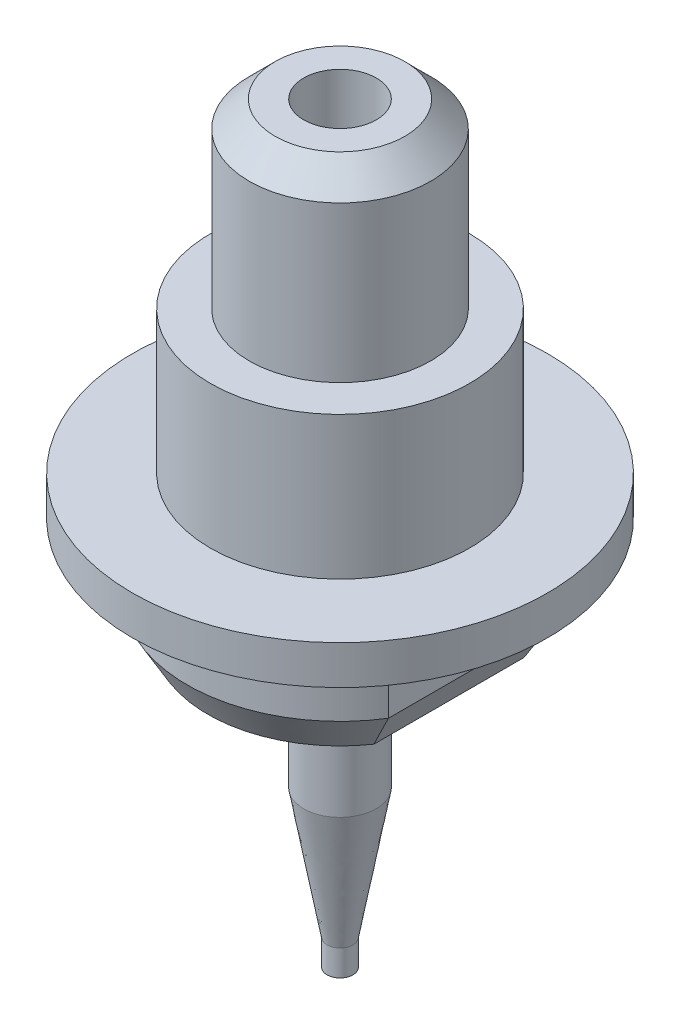
ISO-10303-21;
HEADER;
FILE_DESCRIPTION(('STEP AP214'),'2;1');
FILE_NAME('part.step','',(''),(''),'','','');
FILE_SCHEMA(('AUTOMOTIVE_DESIGN { 1 0 10303 214 1 1 1 1 }'));
ENDSEC;
DATA;
#1=APPLICATION_CONTEXT('core data for automotive mechanical design processes');
#2=APPLICATION_PROTOCOL_DEFINITION('international standard','automotive_design',2000,#1);
#3=PRODUCT_CONTEXT('',#1,'mechanical');
#4=PRODUCT('Part','Part','',(#3));
#5=PRODUCT_RELATED_PRODUCT_CATEGORY('part','',(#4));
#6=PRODUCT_DEFINITION_FORMATION('','',#4);
#7=PRODUCT_DEFINITION_CONTEXT('part definition',#1,'design');
#8=PRODUCT_DEFINITION('design','',#6,#7);
#9=PRODUCT_DEFINITION_SHAPE('','',#8);
#10=(LENGTH_UNIT() NAMED_UNIT(*) SI_UNIT(.MILLI.,.METRE.));
#11=(NAMED_UNIT(*) PLANE_ANGLE_UNIT() SI_UNIT($,.RADIAN.));
#12=(NAMED_UNIT(*) SI_UNIT($,.STERADIAN.) SOLID_ANGLE_UNIT());
#13=UNCERTAINTY_MEASURE_WITH_UNIT(LENGTH_MEASURE(1.E-05),#10,'distance_accuracy_value','');
#14=(GEOMETRIC_REPRESENTATION_CONTEXT(3) GLOBAL_UNCERTAINTY_ASSIGNED_CONTEXT((#13)) GLOBAL_UNIT_ASSIGNED_CONTEXT((#10,
#11,#12)) REPRESENTATION_CONTEXT('',''));
#15=CARTESIAN_POINT('',(0.,0.,0.));
#16=DIRECTION('',(0.,0.,1.));
#17=DIRECTION('',(1.,0.,0.));
#18=AXIS2_PLACEMENT_3D('',#15,#16,#17);
#19=CARTESIAN_POINT('',(0.,2.,0.));
#20=DIRECTION('',(0.,-1.,0.));
#21=DIRECTION('',(0.,0.,-1.));
#22=AXIS2_PLACEMENT_3D('',#19,#20,#21);
#23=PLANE('',#22);
#24=CARTESIAN_POINT('',(0.,2.,0.));
#25=DIRECTION('',(0.,-1.,0.));
#26=DIRECTION('',(0.,0.,-1.));
#27=AXIS2_PLACEMENT_3D('',#24,#25,#26);
#28=CIRCLE('',#27,1.4);
#29=CARTESIAN_POINT('',(0.,2.,-1.4));
#30=VERTEX_POINT('',#29);
#31=EDGE_CURVE('E93',#30,#30,#28,.T.);
#32=ORIENTED_EDGE('',*,*,#31,.F.);
#33=EDGE_LOOP('',(#32));
#34=FACE_BOUND('',#33,.T.);
#35=CARTESIAN_POINT('',(0.,2.,0.));
#36=DIRECTION('',(0.,-1.,0.));
#37=DIRECTION('',(0.,0.,-1.));
#38=AXIS2_PLACEMENT_3D('',#35,#36,#37);
#39=CIRCLE('',#38,0.75);
#40=CARTESIAN_POINT('',(0.,2.,-0.75));
#41=VERTEX_POINT('',#40);
#42=EDGE_CURVE('E97',#41,#41,#39,.T.);
#43=ORIENTED_EDGE('',*,*,#42,.T.);
#44=EDGE_LOOP('',(#43));
#45=FACE_BOUND('',#44,.T.);
#46=ADVANCED_FACE('F81',(#34,#45),#23,.F.);
#47=CARTESIAN_POINT('',(0.,-16.,0.));
#48=DIRECTION('',(0.,1.,0.));
#49=DIRECTION('',(0.,0.,1.));
#50=AXIS2_PLACEMENT_3D('',#47,#48,#49);
#51=CYLINDRICAL_SURFACE('',#50,1.4);
#52=CARTESIAN_POINT('',(0.,-16.,1.4));
#53=CARTESIAN_POINT('',(0.0393216937098484,-16.0000007892401,1.4000003131523));
#54=CARTESIAN_POINT('',(0.0786382960222943,-16.0001722090396,1.39834178095766));
#55=CARTESIAN_POINT('',(0.156995500797011,-16.0005925554339,1.39172572985046));
#56=CARTESIAN_POINT('',(0.196036025732516,-16.0008415029796,1.38676731877211));
#57=CARTESIAN_POINT('',(0.312393201915377,-16.001431235296,1.36696396784312));
#58=CARTESIAN_POINT('',(0.388933066664016,-16.001614783389,1.34719092020336));
#59=CARTESIAN_POINT('',(0.537529913877709,-16.0013074647237,1.29509338299826));
#60=CARTESIAN_POINT('',(0.609588813150662,-16.0008168884368,1.26277430365806));
#61=CARTESIAN_POINT('',(0.747253921050134,-15.9997458502921,1.18650677388441));
#62=CARTESIAN_POINT('',(0.812861629178133,-15.9991654094034,1.14256103473391));
#63=CARTESIAN_POINT('',(0.935791002007864,-15.9984849812148,1.04426634234537));
#64=CARTESIAN_POINT('',(0.993109976488983,-15.9983851495651,0.989914024754273));
#65=CARTESIAN_POINT('',(1.09781287014054,-15.9987596750445,0.872353853206715));
#66=CARTESIAN_POINT('',(1.14519629331879,-15.999234060831,0.80914555741402));
#67=CARTESIAN_POINT('',(1.22865735532298,-16.0003035901375,0.675717686181329));
#68=CARTESIAN_POINT('',(1.26474063268452,-16.0008986731871,0.605501630605559));
#69=CARTESIAN_POINT('',(1.3246183529307,-16.0015496609527,0.459965423719512));
#70=CARTESIAN_POINT('',(1.34841294539108,-16.0016055722314,0.384645334547272));
#71=CARTESIAN_POINT('',(1.37437057062438,-16.0012309362582,0.269556222117197));
#72=CARTESIAN_POINT('',(1.38140178719181,-16.0010294298944,0.230822258547849));
#73=CARTESIAN_POINT('',(1.39218160620722,-16.0005761710324,0.152890081471909));
#74=CARTESIAN_POINT('',(1.39593022353617,-16.000324418762,0.113691870070702));
#75=CARTESIAN_POINT('',(1.40011250319624,-16.000021919616,0.0351203280129748));
#76=CARTESIAN_POINT('',(1.4005461538853,-15.9999711734463,-0.00425300325807689));
#77=CARTESIAN_POINT('',(1.39809728077081,-16.0001583270204,-0.0828958674022004));
#78=CARTESIAN_POINT('',(1.39521472553051,-16.0003962295005,-0.122165399287745));
#79=CARTESIAN_POINT('',(1.3861518433967,-16.0008563887578,-0.200324924973521));
#80=CARTESIAN_POINT('',(1.37997149065616,-16.0010786454123,-0.239214915796604));
#81=CARTESIAN_POINT('',(1.36436323144387,-16.0014034085328,-0.316327101550431));
#82=CARTESIAN_POINT('',(1.3549353509499,-16.0015059159567,-0.354549301820425));
#83=CARTESIAN_POINT('',(1.32186464873798,-16.0015534186967,-0.467808402568983));
#84=CARTESIAN_POINT('',(1.29342654697467,-16.0012390385523,-0.541508124406898));
#85=CARTESIAN_POINT('',(1.22460634572269,-16.0002964313766,-0.683036831356676));
#86=CARTESIAN_POINT('',(1.18422601183096,-15.9996682507295,-0.750866682383589));
#87=CARTESIAN_POINT('',(1.09265342039527,-15.9987503471523,-0.878802011310766));
#88=CARTESIAN_POINT('',(1.04146130547654,-15.9984606197578,-0.938907591090083));
#89=CARTESIAN_POINT('',(0.929692437361932,-15.9984897331444,-1.04969818260673));
#90=CARTESIAN_POINT('',(0.869111748474547,-15.9988088297822,-1.10037922388515));
#91=CARTESIAN_POINT('',(0.740315773223336,-15.99975755049,-1.19085255236711));
#92=CARTESIAN_POINT('',(0.672100382080925,-16.0003871788223,-1.23064469010561));
#93=CARTESIAN_POINT('',(0.529911480865264,-16.001297649611,-1.29822214722529));
#94=CARTESIAN_POINT('',(0.455937850994468,-16.0015784848089,-1.32600721672603));
#95=CARTESIAN_POINT('',(0.34235284169462,-16.0014808249119,-1.35806865447328));
#96=CARTESIAN_POINT('',(0.304036126320944,-16.0013616176227,-1.36715500407447));
#97=CARTESIAN_POINT('',(0.22676387130786,-16.0010120957545,-1.38207240785148));
#98=CARTESIAN_POINT('',(0.187808327343779,-16.000781780423,-1.38790343998045));
#99=CARTESIAN_POINT('',(0.109562380828848,-16.0003263080238,-1.39626082628735));
#100=CARTESIAN_POINT('',(0.0702721177505815,-16.0001011489392,-1.3987884950574));
#101=CARTESIAN_POINT('',(-0.00838214677491609,-15.9999664582848,-1.40052742700166));
#102=CARTESIAN_POINT('',(-0.0477461476827115,-16.0000569244148,-1.39973871434319));
#103=CARTESIAN_POINT('',(-0.126269107623649,-16.0003998230533,-1.3948486775516));
#104=CARTESIAN_POINT('',(-0.165428067970524,-16.0006522545227,-1.39074737466906));
#105=CARTESIAN_POINT('',(-0.243252323295334,-16.0010945600716,-1.37926712670207));
#106=CARTESIAN_POINT('',(-0.28191761714092,-16.0012844340077,-1.37188817410088));
#107=CARTESIAN_POINT('',(-0.396769444466619,-16.0016157637235,-1.34489564728222));
#108=CARTESIAN_POINT('',(-0.471876795553557,-16.001519625736,-1.32042230532975));
#109=CARTESIAN_POINT('',(-0.616876241594359,-16.0008176078851,-1.25923209483822));
#110=CARTESIAN_POINT('',(-0.686768281901605,-16.0002117226813,-1.22251509803078));
#111=CARTESIAN_POINT('',(-0.819415933788415,-15.9991547900732,-1.13786815644837));
#112=CARTESIAN_POINT('',(-0.882171193700642,-15.9987037502968,-1.08993765947974));
#113=CARTESIAN_POINT('',(-0.998745844298316,-15.9983855367757,-0.984225086338901));
#114=CARTESIAN_POINT('',(-1.05256533041354,-15.9985183567952,-0.926443115389057));
#115=CARTESIAN_POINT('',(-1.14973824980986,-15.9992439924382,-0.802677742321164));
#116=CARTESIAN_POINT('',(-1.19309293613053,-15.9998367529531,-0.736695323547251));
#117=CARTESIAN_POINT('',(-1.26811656345905,-16.0008949154218,-0.598388119222348));
#118=CARTESIAN_POINT('',(-1.29978562215249,-16.0013603186583,-0.52606339755358));
#119=CARTESIAN_POINT('',(-1.35055332850714,-16.0016076192207,-0.377099628403767));
#120=CARTESIAN_POINT('',(-1.36964593791482,-16.0013891885107,-0.300458527666785));
#121=CARTESIAN_POINT('',(-1.39468943446018,-16.0005596139046,-0.145018687116253));
#122=CARTESIAN_POINT('',(-1.40064020351767,-15.99994846648,-0.0662199279224581));
#123=CARTESIAN_POINT('',(-1.39959672325148,-16.0000344026059,0.0518004322155933));
#124=CARTESIAN_POINT('',(-1.39758507188576,-16.0002303786809,0.0911233544943963));
#125=CARTESIAN_POINT('',(-1.3902628398081,-16.0006702445924,0.169460645909378));
#126=CARTESIAN_POINT('',(-1.38495221211298,-16.0009141351113,0.208475010643144));
#127=CARTESIAN_POINT('',(-1.36410900276799,-16.0014735246991,0.324624667771904));
#128=CARTESIAN_POINT('',(-1.3436643921085,-16.0016174914455,0.40093835770654));
#129=CARTESIAN_POINT('',(-1.29026577128235,-16.0012486033474,0.549015270429335));
#130=CARTESIAN_POINT('',(-1.25731088431899,-16.0007357024595,0.620778173859019));
#131=CARTESIAN_POINT('',(-1.17982334158538,-15.999656196509,0.757763361657951));
#132=CARTESIAN_POINT('',(-1.13529102049138,-15.9990895929991,0.822985835020064));
#133=CARTESIAN_POINT('',(-1.03590511134114,-15.9984563068909,0.94503773878526));
#134=CARTESIAN_POINT('',(-0.981050342228748,-15.9983896815339,1.00186620744817));
#135=CARTESIAN_POINT('',(-0.862564084261604,-15.9988190753378,1.10552218725675));
#136=CARTESIAN_POINT('',(-0.798930334819243,-15.9993152396554,1.15234711455006));
#137=CARTESIAN_POINT('',(-0.664714002845273,-16.0003934816277,1.23464791117073));
#138=CARTESIAN_POINT('',(-0.594131427457772,-16.0009755591939,1.27012379216593));
#139=CARTESIAN_POINT('',(-0.448064563813999,-16.0015751603895,1.32868892586905));
#140=CARTESIAN_POINT('',(-0.37258624750717,-16.0015933593409,1.35179296295379));
#141=CARTESIAN_POINT('',(-0.247206572320034,-16.0011352084038,1.37889993356999));
#142=CARTESIAN_POINT('',(-0.198110446695811,-16.0008383233323,1.38680295027653));
#143=CARTESIAN_POINT('',(-0.0993401723335178,-16.0002702207269,1.39735277978865));
#144=CARTESIAN_POINT('',(-0.0496660249013429,-15.999999003135,1.39999960446694));
#145=CARTESIAN_POINT('',(0.,-16.,1.4));
#146=B_SPLINE_CURVE_WITH_KNOTS('',3,(#52,#53,#54,#55,#56,#57,#58,#59,#60,#61,#62,#63,#64,#65,
#66,#67,#68,#69,#70,#71,#72,#73,#74,#75,#76,#77,#78,#79,#80,#81,#82,#83,#84,#85,#86,#87,#88,#89,
#90,#91,#92,#93,#94,#95,#96,#97,#98,#99,#100,#101,#102,#103,#104,#105,#106,#107,#108,#109,#110,
#111,#112,#113,#114,#115,#116,#117,#118,#119,#120,#121,#122,#123,#124,#125,#126,#127,#128,#129,
#130,#131,#132,#133,#134,#135,#136,#137,#138,#139,#140,#141,#142,#143,#144,#145),.UNSPECIFIED.,
.T.,.F.,(4,2,2,2,2,2,2,2,2,2,2,2,2,2,2,2,2,2,2,2,2,2,2,2,2,2,2,2,2,2,2,2,2,2,2,2,2,2,2,2,2,2,2,
2,2,2,4),(0.,0.117916829196745,0.235865551722404,0.471799692945596,0.707632205110841,
0.943409770631339,1.17926369001541,1.41512938065021,1.65087719103988,1.8866221318804,
2.00460988517337,2.1225971035908,2.24058473637584,2.3585734876614,2.47656316371679,
2.59455189596547,2.830319634321,3.06605253305254,3.30178232227264,3.53761119809127,
3.77344331082018,4.00928033124123,4.12730382337346,4.24532811481819,4.36330542351301,
4.48128187247834,4.5992575646194,4.717233527319,4.95299289827607,5.18875473919979,
5.42452819234123,5.66029912737336,5.89604181752405,6.13178213345232,6.3676355515945,
6.60349108888455,6.72149366395051,6.8394979196179,7.07529364650869,7.31110590245875,
7.54691134239164,7.78274377872893,8.01863705566359,8.25453009007826,8.49014059920752,
8.63907806479707,8.78801519396518),.UNSPECIFIED.);
#147=CARTESIAN_POINT('',(0.,-16.,-1.4));
#148=VERTEX_POINT('',#147);
#149=EDGE_CURVE('E13',#148,#148,#146,.F.);
#150=ORIENTED_EDGE('',*,*,#149,.F.);
#151=EDGE_LOOP('',(#150));
#152=FACE_BOUND('',#151,.T.);
#153=ORIENTED_EDGE('',*,*,#31,.T.);
#154=EDGE_LOOP('',(#153));
#155=FACE_BOUND('',#154,.T.);
#156=ADVANCED_FACE('F83',(#152,#155),#51,.T.);
#157=CARTESIAN_POINT('',(0.,-16.,0.));
#158=DIRECTION('',(0.,1.,0.));
#159=DIRECTION('',(0.,0.,1.));
#160=AXIS2_PLACEMENT_3D('',#157,#158,#159);
#161=CYLINDRICAL_SURFACE('',#160,0.75);
#162=CARTESIAN_POINT('',(0.,-16.,0.));
#163=DIRECTION('',(0.,-1.,0.));
#164=DIRECTION('',(0.,0.,-1.));
#165=AXIS2_PLACEMENT_3D('',#162,#163,#164);
#166=CIRCLE('',#165,0.75);
#167=CARTESIAN_POINT('',(0.,-16.,-0.75));
#168=VERTEX_POINT('',#167);
#169=EDGE_CURVE('E101',#168,#168,#166,.T.);
#170=ORIENTED_EDGE('',*,*,#169,.T.);
#171=EDGE_LOOP('',(#170));
#172=FACE_BOUND('',#171,.T.);
#173=ORIENTED_EDGE('',*,*,#42,.F.);
#174=EDGE_LOOP('',(#173));
#175=FACE_BOUND('',#174,.T.);
#176=ADVANCED_FACE('F132',(#172,#175),#161,.F.);
#177=CARTESIAN_POINT('',(0.,-16.,0.));
#178=DIRECTION('',(0.,-1.,0.));
#179=DIRECTION('',(0.,0.,-1.));
#180=AXIS2_PLACEMENT_3D('',#177,#178,#179);
#181=PLANE('',#180);
#182=ORIENTED_EDGE('',*,*,#169,.F.);
#183=EDGE_LOOP('',(#182));
#184=FACE_BOUND('',#183,.T.);
#185=ADVANCED_FACE('F130',(#184),#181,.F.);
#186=CARTESIAN_POINT('',(0.,-15.95,-1.409));
#187=CARTESIAN_POINT('',(0.,-15.9666666666667,-1.406));
#188=CARTESIAN_POINT('',(0.,-15.9833333333333,-1.403));
#189=CARTESIAN_POINT('',(0.,-16.,-1.4));
#190=CARTESIAN_POINT('',(0.,-17.6666666666667,-1.1));
#191=CARTESIAN_POINT('',(0.,-19.3333333333333,-0.8));
#192=CARTESIAN_POINT('',(0.,-21.,-0.5));
#193=CARTESIAN_POINT('',(0.0388824124490821,-15.95,-1.409));
#194=CARTESIAN_POINT('',(0.0387996251975936,-15.9666666666667,-1.406));
#195=CARTESIAN_POINT('',(0.0387168379461052,-15.9833333333333,-1.403));
#196=CARTESIAN_POINT('',(0.0386340506946167,-16.,-1.4));
#197=CARTESIAN_POINT('',(0.0303553255457703,-17.6666666666667,-1.1));
#198=CARTESIAN_POINT('',(0.0220766003969238,-19.3333333333333,-0.8));
#199=CARTESIAN_POINT('',(0.0137978752480773,-21.,-0.5));
#200=CARTESIAN_POINT('',(0.11591575485743,-15.95,-1.40584324124491));
#201=CARTESIAN_POINT('',(0.115668950553262,-15.9666666666667,-1.40284996251976));
#202=CARTESIAN_POINT('',(0.115422146249095,-15.9833333333333,-1.39985668379461));
#203=CARTESIAN_POINT('',(0.115175341944927,-16.,-1.39686340506946));
#204=CARTESIAN_POINT('',(0.090494911528157,-17.6666666666667,-1.09753553255458));
#205=CARTESIAN_POINT('',(0.0658144811113869,-19.3333333333333,-0.798207660039692));
#206=CARTESIAN_POINT('',(0.0411340506946168,-21.,-0.498879787524808));
#207=CARTESIAN_POINT('',(0.228907529560712,-15.95,-1.39200161828679));
#208=CARTESIAN_POINT('',(0.228420146602102,-15.9666666666667,-1.38903781072478));
#209=CARTESIAN_POINT('',(0.227932763643491,-15.9833333333333,-1.38607400316278));
#210=CARTESIAN_POINT('',(0.227445380684881,-16.,-1.38311019560078));
#211=CARTESIAN_POINT('',(0.178707084823835,-17.6666666666667,-1.08672943940061));
#212=CARTESIAN_POINT('',(0.129968788962789,-19.3333333333333,-0.790348683200447));
#213=CARTESIAN_POINT('',(0.0812304931017431,-21.,-0.493967927000279));
#214=CARTESIAN_POINT('',(0.338977273914962,-15.95,-1.36941730194297));
#215=CARTESIAN_POINT('',(0.338255533800168,-15.9666666666667,-1.3665015802213));
#216=CARTESIAN_POINT('',(0.337533793685374,-15.9833333333333,-1.36358585849964));
#217=CARTESIAN_POINT('',(0.33681205357058,-16.,-1.36067013677797));
#218=CARTESIAN_POINT('',(0.26463804209117,-17.6666666666667,-1.06909796461126));
#219=CARTESIAN_POINT('',(0.19246403061176,-19.3333333333333,-0.777525792444555));
#220=CARTESIAN_POINT('',(0.12029001913235,-21.,-0.485953620277847));
#221=CARTESIAN_POINT('',(0.979680809307521,-15.95,-1.18363799220468));
#222=CARTESIAN_POINT('',(0.977594902687278,-15.9666666666667,-1.18111782614604));
#223=CARTESIAN_POINT('',(0.975508996067035,-15.9833333333333,-1.17859766008741));
#224=CARTESIAN_POINT('',(0.973423089446791,-16.,-1.17607749402878));
#225=CARTESIAN_POINT('',(0.764832427422479,-17.6666666666667,-0.924060888165469));
#226=CARTESIAN_POINT('',(0.556241765398167,-19.3333333333333,-0.672044282302159));
#227=CARTESIAN_POINT('',(0.347651103373854,-21.,-0.420027676438849));
#228=CARTESIAN_POINT('',(1.409,-15.95,-0.622118599185318));
#229=CARTESIAN_POINT('',(1.406,-15.9666666666667,-0.620794003161503));
#230=CARTESIAN_POINT('',(1.403,-15.9833333333333,-0.619469407137687));
#231=CARTESIAN_POINT('',(1.4,-16.,-0.618144811113872));
#232=CARTESIAN_POINT('',(1.1,-17.6666666666667,-0.485685208732328));
#233=CARTESIAN_POINT('',(0.8,-19.3333333333333,-0.353225606350784));
#234=CARTESIAN_POINT('',(0.5,-21.,-0.22076600396924));
#235=CARTESIAN_POINT('',(1.409,-15.95,0.777648248981648));
#236=CARTESIAN_POINT('',(1.406,-15.9666666666667,0.775992503951878));
#237=CARTESIAN_POINT('',(1.403,-15.9833333333333,0.774336758922109));
#238=CARTESIAN_POINT('',(1.4,-16.,0.77268101389234));
#239=CARTESIAN_POINT('',(1.1,-17.6666666666667,0.60710651091541));
#240=CARTESIAN_POINT('',(0.8,-19.3333333333333,0.44153200793848));
#241=CARTESIAN_POINT('',(0.5,-21.,0.27595750496155));
#242=CARTESIAN_POINT('',(0.777648248981648,-15.95,1.409));
#243=CARTESIAN_POINT('',(0.775992503951879,-15.9666666666667,1.406));
#244=CARTESIAN_POINT('',(0.77433675892211,-15.9833333333333,1.403));
#245=CARTESIAN_POINT('',(0.77268101389234,-16.,1.4));
#246=CARTESIAN_POINT('',(0.60710651091541,-17.6666666666667,1.1));
#247=CARTESIAN_POINT('',(0.44153200793848,-19.3333333333333,0.8));
#248=CARTESIAN_POINT('',(0.27595750496155,-21.,0.5));
#249=CARTESIAN_POINT('',(-0.777648248981648,-15.95,1.409));
#250=CARTESIAN_POINT('',(-0.775992503951878,-15.9666666666667,1.406));
#251=CARTESIAN_POINT('',(-0.774336758922109,-15.9833333333333,1.403));
#252=CARTESIAN_POINT('',(-0.77268101389234,-16.,1.4));
#253=CARTESIAN_POINT('',(-0.60710651091541,-17.6666666666667,1.1));
#254=CARTESIAN_POINT('',(-0.44153200793848,-19.3333333333333,0.8));
#255=CARTESIAN_POINT('',(-0.27595750496155,-21.,0.5));
#256=CARTESIAN_POINT('',(-1.409,-15.95,0.777648248981648));
#257=CARTESIAN_POINT('',(-1.406,-15.9666666666667,0.775992503951879));
#258=CARTESIAN_POINT('',(-1.403,-15.9833333333333,0.77433675892211));
#259=CARTESIAN_POINT('',(-1.4,-16.,0.77268101389234));
#260=CARTESIAN_POINT('',(-1.1,-17.6666666666667,0.60710651091541));
#261=CARTESIAN_POINT('',(-0.8,-19.3333333333333,0.44153200793848));
#262=CARTESIAN_POINT('',(-0.5,-21.,0.27595750496155));
#263=CARTESIAN_POINT('',(-1.409,-15.95,-0.622118599185318));
#264=CARTESIAN_POINT('',(-1.406,-15.9666666666667,-0.620794003161503));
#265=CARTESIAN_POINT('',(-1.403,-15.9833333333333,-0.619469407137687));
#266=CARTESIAN_POINT('',(-1.4,-16.,-0.618144811113872));
#267=CARTESIAN_POINT('',(-1.1,-17.6666666666667,-0.485685208732328));
#268=CARTESIAN_POINT('',(-0.8,-19.3333333333333,-0.353225606350784));
#269=CARTESIAN_POINT('',(-0.5,-21.,-0.22076600396924));
#270=CARTESIAN_POINT('',(-0.979680809307521,-15.95,-1.18363799220468));
#271=CARTESIAN_POINT('',(-0.977594902687278,-15.9666666666667,-1.18111782614604));
#272=CARTESIAN_POINT('',(-0.975508996067035,-15.9833333333333,-1.17859766008741));
#273=CARTESIAN_POINT('',(-0.973423089446792,-16.,-1.17607749402878));
#274=CARTESIAN_POINT('',(-0.764832427422479,-17.6666666666667,-0.924060888165469));
#275=CARTESIAN_POINT('',(-0.556241765398167,-19.3333333333333,-0.672044282302159));
#276=CARTESIAN_POINT('',(-0.347651103373854,-21.,-0.420027676438849));
#277=CARTESIAN_POINT('',(-0.338977273914963,-15.95,-1.36941730194297));
#278=CARTESIAN_POINT('',(-0.338255533800168,-15.9666666666667,-1.3665015802213));
#279=CARTESIAN_POINT('',(-0.337533793685374,-15.9833333333333,-1.36358585849964));
#280=CARTESIAN_POINT('',(-0.33681205357058,-16.,-1.36067013677797));
#281=CARTESIAN_POINT('',(-0.26463804209117,-17.6666666666667,-1.06909796461126));
#282=CARTESIAN_POINT('',(-0.19246403061176,-19.3333333333333,-0.777525792444555));
#283=CARTESIAN_POINT('',(-0.12029001913235,-21.,-0.485953620277847));
#284=CARTESIAN_POINT('',(-0.228907529560713,-15.95,-1.39200161828679));
#285=CARTESIAN_POINT('',(-0.228420146602102,-15.9666666666667,-1.38903781072478));
#286=CARTESIAN_POINT('',(-0.227932763643492,-15.9833333333333,-1.38607400316278));
#287=CARTESIAN_POINT('',(-0.227445380684881,-16.,-1.38311019560078));
#288=CARTESIAN_POINT('',(-0.178707084823835,-17.6666666666667,-1.08672943940061));
#289=CARTESIAN_POINT('',(-0.129968788962789,-19.3333333333333,-0.790348683200446));
#290=CARTESIAN_POINT('',(-0.0812304931017433,-21.,-0.493967927000279));
#291=CARTESIAN_POINT('',(-0.115915754857431,-15.95,-1.40584324124491));
#292=CARTESIAN_POINT('',(-0.115668950553263,-15.9666666666667,-1.40284996251976));
#293=CARTESIAN_POINT('',(-0.115422146249095,-15.9833333333333,-1.39985668379461));
#294=CARTESIAN_POINT('',(-0.115175341944928,-16.,-1.39686340506946));
#295=CARTESIAN_POINT('',(-0.0904949115281575,-17.6666666666667,-1.09753553255458));
#296=CARTESIAN_POINT('',(-0.0658144811113873,-19.3333333333333,-0.798207660039692));
#297=CARTESIAN_POINT('',(-0.0411340506946171,-21.,-0.498879787524808));
#298=CARTESIAN_POINT('',(-0.0388824124490824,-15.95,-1.409));
#299=CARTESIAN_POINT('',(-0.038799625197594,-15.9666666666667,-1.406));
#300=CARTESIAN_POINT('',(-0.0387168379461055,-15.9833333333333,-1.403));
#301=CARTESIAN_POINT('',(-0.038634050694617,-16.,-1.4));
#302=CARTESIAN_POINT('',(-0.0303553255457705,-17.6666666666667,-1.1));
#303=CARTESIAN_POINT('',(-0.0220766003969241,-19.3333333333333,-0.8));
#304=CARTESIAN_POINT('',(-0.0137978752480776,-21.,-0.5));
#305=CARTESIAN_POINT('',(0.,-15.95,-1.409));
#306=CARTESIAN_POINT('',(0.,-15.9666666666667,-1.406));
#307=CARTESIAN_POINT('',(0.,-15.9833333333333,-1.403));
#308=CARTESIAN_POINT('',(0.,-16.,-1.4));
#309=CARTESIAN_POINT('',(0.,-17.6666666666667,-1.1));
#310=CARTESIAN_POINT('',(0.,-19.3333333333333,-0.8));
#311=CARTESIAN_POINT('',(0.,-21.,-0.5));
#312=B_SPLINE_SURFACE_WITH_KNOTS('',3,3,((#186,#187,#188,#189,#190,#191,#192),(#193,#194,#195,
#196,#197,#198,#199),(#200,#201,#202,#203,#204,#205,#206),(#207,#208,#209,#210,#211,#212,#213),
(#214,#215,#216,#217,#218,#219,#220),(#221,#222,#223,#224,#225,#226,#227),(#228,#229,#230,#231,
#232,#233,#234),(#235,#236,#237,#238,#239,#240,#241),(#242,#243,#244,#245,#246,#247,#248),(#249,
#250,#251,#252,#253,#254,#255),(#256,#257,#258,#259,#260,#261,#262),(#263,#264,#265,#266,#267,
#268,#269),(#270,#271,#272,#273,#274,#275,#276),(#277,#278,#279,#280,#281,#282,#283),(#284,#285,
#286,#287,#288,#289,#290),(#291,#292,#293,#294,#295,#296,#297),(#298,#299,#300,#301,#302,#303,
#304),(#305,#306,#307,#308,#309,#310,#311)),.UNSPECIFIED.,.T.,.F.,.F.,(4,1,1,1,1,2,2,2,1,1,1,1,
4),(4,3,4),(0.,0.0125,0.0249999999999999,0.0375000000000001,0.05,0.25,0.5,0.75,0.95,0.9625,
0.975,0.9875,1.),(-0.01,0.,1.),.UNSPECIFIED.);
#313=CARTESIAN_POINT('',(0.,-21.,0.));
#314=DIRECTION('',(0.,-1.,0.));
#315=DIRECTION('',(0.,0.,-1.));
#316=AXIS2_PLACEMENT_3D('',#313,#314,#315);
#317=CIRCLE('',#316,0.5);
#318=CARTESIAN_POINT('',(0.,-21.,-0.5));
#319=VERTEX_POINT('',#318);
#320=EDGE_CURVE('E106',#319,#319,#317,.T.);
#321=CARTESIAN_POINT('',(0.,-16.,-1.4));
#322=CARTESIAN_POINT('',(0.,-16.0520833333333,-1.390625));
#323=CARTESIAN_POINT('',(0.,-16.1041666666667,-1.38125));
#324=CARTESIAN_POINT('',(0.,-16.2083333333333,-1.3625));
#325=CARTESIAN_POINT('',(0.,-16.2604166666667,-1.353125));
#326=CARTESIAN_POINT('',(0.,-16.3645833333333,-1.334375));
#327=CARTESIAN_POINT('',(0.,-16.4166666666667,-1.325));
#328=CARTESIAN_POINT('',(0.,-16.5208333333333,-1.30625));
#329=CARTESIAN_POINT('',(0.,-16.5729166666667,-1.296875));
#330=CARTESIAN_POINT('',(0.,-16.6770833333333,-1.278125));
#331=CARTESIAN_POINT('',(0.,-16.7291666666667,-1.26875));
#332=CARTESIAN_POINT('',(0.,-16.8333333333333,-1.25));
#333=CARTESIAN_POINT('',(0.,-16.8854166666667,-1.240625));
#334=CARTESIAN_POINT('',(0.,-16.9895833333333,-1.221875));
#335=CARTESIAN_POINT('',(0.,-17.0416666666667,-1.2125));
#336=CARTESIAN_POINT('',(0.,-17.1458333333333,-1.19375));
#337=CARTESIAN_POINT('',(0.,-17.1979166666667,-1.184375));
#338=CARTESIAN_POINT('',(0.,-17.3020833333333,-1.165625));
#339=CARTESIAN_POINT('',(0.,-17.3541666666667,-1.15625));
#340=CARTESIAN_POINT('',(0.,-17.4583333333333,-1.1375));
#341=CARTESIAN_POINT('',(0.,-17.5104166666667,-1.128125));
#342=CARTESIAN_POINT('',(0.,-17.6145833333333,-1.109375));
#343=CARTESIAN_POINT('',(0.,-17.6666666666667,-1.1));
#344=CARTESIAN_POINT('',(0.,-17.7708333333333,-1.08125));
#345=CARTESIAN_POINT('',(0.,-17.8229166666667,-1.071875));
#346=CARTESIAN_POINT('',(0.,-17.9270833333333,-1.053125));
#347=CARTESIAN_POINT('',(0.,-17.9791666666667,-1.04375));
#348=CARTESIAN_POINT('',(0.,-18.0833333333333,-1.025));
#349=CARTESIAN_POINT('',(0.,-18.1354166666667,-1.015625));
#350=CARTESIAN_POINT('',(0.,-18.2395833333333,-0.996875));
#351=CARTESIAN_POINT('',(0.,-18.2916666666667,-0.9875));
#352=CARTESIAN_POINT('',(0.,-18.3958333333333,-0.96875));
#353=CARTESIAN_POINT('',(0.,-18.4479166666667,-0.959375));
#354=CARTESIAN_POINT('',(0.,-18.5520833333333,-0.940625));
#355=CARTESIAN_POINT('',(0.,-18.6041666666667,-0.93125));
#356=CARTESIAN_POINT('',(0.,-18.7083333333333,-0.9125));
#357=CARTESIAN_POINT('',(0.,-18.7604166666667,-0.903125));
#358=CARTESIAN_POINT('',(0.,-18.8645833333333,-0.884375));
#359=CARTESIAN_POINT('',(0.,-18.9166666666667,-0.875));
#360=CARTESIAN_POINT('',(0.,-19.0208333333333,-0.85625));
#361=CARTESIAN_POINT('',(0.,-19.0729166666667,-0.846875));
#362=CARTESIAN_POINT('',(0.,-19.1770833333333,-0.828125));
#363=CARTESIAN_POINT('',(0.,-19.2291666666667,-0.81875));
#364=CARTESIAN_POINT('',(0.,-19.3333333333333,-0.8));
#365=CARTESIAN_POINT('',(0.,-19.3854166666667,-0.790625));
#366=CARTESIAN_POINT('',(0.,-19.4895833333333,-0.771875));
#367=CARTESIAN_POINT('',(0.,-19.5416666666667,-0.7625));
#368=CARTESIAN_POINT('',(0.,-19.6458333333333,-0.74375));
#369=CARTESIAN_POINT('',(0.,-19.6979166666667,-0.734375));
#370=CARTESIAN_POINT('',(0.,-19.8020833333333,-0.715625));
#371=CARTESIAN_POINT('',(0.,-19.8541666666667,-0.70625));
#372=CARTESIAN_POINT('',(0.,-19.9583333333333,-0.6875));
#373=CARTESIAN_POINT('',(0.,-20.0104166666667,-0.678125));
#374=CARTESIAN_POINT('',(0.,-20.1145833333333,-0.659375));
#375=CARTESIAN_POINT('',(0.,-20.1666666666667,-0.65));
#376=CARTESIAN_POINT('',(0.,-20.2708333333333,-0.63125));
#377=CARTESIAN_POINT('',(0.,-20.3229166666667,-0.621875));
#378=CARTESIAN_POINT('',(0.,-20.4270833333333,-0.603125));
#379=CARTESIAN_POINT('',(0.,-20.4791666666667,-0.59375));
#380=CARTESIAN_POINT('',(0.,-20.5833333333333,-0.575));
#381=CARTESIAN_POINT('',(0.,-20.6354166666667,-0.565625));
#382=CARTESIAN_POINT('',(0.,-20.7395833333333,-0.546875));
#383=CARTESIAN_POINT('',(0.,-20.7916666666667,-0.5375));
#384=CARTESIAN_POINT('',(0.,-20.8958333333333,-0.51875));
#385=CARTESIAN_POINT('',(0.,-20.9479166666667,-0.509375));
#386=CARTESIAN_POINT('',(0.,-21.,-0.5));
#387=B_SPLINE_CURVE_WITH_KNOTS('',3,(#321,#322,#323,#324,#325,#326,#327,#328,#329,#330,#331,
#332,#333,#334,#335,#336,#337,#338,#339,#340,#341,#342,#343,#344,#345,#346,#347,#348,#349,#350,
#351,#352,#353,#354,#355,#356,#357,#358,#359,#360,#361,#362,#363,#364,#365,#366,#367,#368,#369,
#370,#371,#372,#373,#374,#375,#376,#377,#378,#379,#380,#381,#382,#383,#384,#385,#386),
.UNSPECIFIED.,.F.,.F.,(4,2,2,2,2,2,2,2,2,2,2,2,2,2,2,2,2,2,2,2,2,2,2,2,2,2,2,2,2,2,2,2,4),(0.,
0.158761072448507,0.317522144897014,0.476283217345521,0.635044289794031,0.793805362242531,
0.952566434691038,1.11132750713954,1.27008857958805,1.42884965203656,1.58761072448507,
1.74637179693357,1.90513286938208,2.06389394183059,2.2226550142791,2.3814160867276,
2.54017715917611,2.69893823162462,2.85769930407312,3.01646037652163,3.17522144897014,
3.33398252141864,3.49274359386715,3.65150466631566,3.81026573876416,3.96902681121267,
4.12778788366118,4.28654895610968,4.44531002855819,4.6040711010067,4.7628321734552,
4.92159324590371,5.08035431835222),.UNSPECIFIED.);
#388=EDGE_CURVE('BSEAM117',#148,#319,#387,.T.);
#389=ORIENTED_EDGE('',*,*,#149,.T.);
#390=ORIENTED_EDGE('',*,*,#320,.F.);
#391=ORIENTED_EDGE('',*,*,#388,.T.);
#392=ORIENTED_EDGE('',*,*,#388,.F.);
#393=EDGE_LOOP('',(#389,#391,#390,#392));
#394=FACE_BOUND('',#393,.T.);
#395=ADVANCED_FACE('F117',(#394),#312,.T.);
#396=CARTESIAN_POINT('',(0.,-22.,0.));
#397=DIRECTION('',(0.,1.,0.));
#398=DIRECTION('',(0.,0.,1.));
#399=AXIS2_PLACEMENT_3D('',#396,#397,#398);
#400=CYLINDRICAL_SURFACE('',#399,0.5);
#401=CARTESIAN_POINT('',(0.,-22.,0.));
#402=DIRECTION('',(0.,-1.,0.));
#403=DIRECTION('',(0.,0.,-1.));
#404=AXIS2_PLACEMENT_3D('',#401,#402,#403);
#405=CIRCLE('',#404,0.5);
#406=CARTESIAN_POINT('',(0.,-22.,-0.5));
#407=VERTEX_POINT('',#406);
#408=EDGE_CURVE('E111',#407,#407,#405,.T.);
#409=ORIENTED_EDGE('',*,*,#408,.F.);
#410=EDGE_LOOP('',(#409));
#411=FACE_BOUND('',#410,.T.);
#412=ORIENTED_EDGE('',*,*,#320,.T.);
#413=EDGE_LOOP('',(#412));
#414=FACE_BOUND('',#413,.T.);
#415=ADVANCED_FACE('F129',(#411,#414),#400,.T.);
#416=CARTESIAN_POINT('',(0.,-22.,0.));
#417=DIRECTION('',(0.,-1.,0.));
#418=DIRECTION('',(0.,0.,-1.));
#419=AXIS2_PLACEMENT_3D('',#416,#417,#418);
#420=PLANE('',#419);
#421=ORIENTED_EDGE('',*,*,#408,.T.);
#422=EDGE_LOOP('',(#421));
#423=FACE_BOUND('',#422,.T.);
#424=ADVANCED_FACE('F172',(#423),#420,.T.);
#425=CLOSED_SHELL('',(#46,#156,#176,#185,#395,#415,#424));
#426=MANIFOLD_SOLID_BREP('B2',#425);
#427=CARTESIAN_POINT('',(0.,-11.,0.));
#428=DIRECTION('',(0.,1.,0.));
#429=DIRECTION('',(0.,0.,1.));
#430=AXIS2_PLACEMENT_3D('',#427,#428,#429);
#431=CYLINDRICAL_SURFACE('',#430,5.9);
#432=DIRECTION('',(0.,-1.,0.));
#433=VECTOR('',#432,1.);
#434=CARTESIAN_POINT('',(5.,-7.,-3.13209195267317));
#435=LINE('',#434,#433);
#436=CARTESIAN_POINT('',(5.,-7.,-3.13209195267317));
#437=VERTEX_POINT('',#436);
#438=CARTESIAN_POINT('',(5.,-9.6143593539449,-3.13209195267317));
#439=VERTEX_POINT('',#438);
#440=EDGE_CURVE('E443',#437,#439,#435,.T.);
#441=ORIENTED_EDGE('',*,*,#440,.T.);
#442=CARTESIAN_POINT('',(0.,-9.6143593539449,0.));
#443=DIRECTION('',(0.,-1.,0.));
#444=DIRECTION('',(0.,0.,-1.));
#445=AXIS2_PLACEMENT_3D('',#442,#443,#444);
#446=CIRCLE('',#445,5.9);
#447=CARTESIAN_POINT('',(-5.,-9.6143593539449,-3.13209195267317));
#448=VERTEX_POINT('',#447);
#449=EDGE_CURVE('E259',#439,#448,#446,.F.);
#450=ORIENTED_EDGE('',*,*,#449,.T.);
#451=DIRECTION('',(0.,-1.,0.));
#452=VECTOR('',#451,1.);
#453=CARTESIAN_POINT('',(-5.,-7.,-3.13209195267317));
#454=LINE('',#453,#452);
#455=CARTESIAN_POINT('',(-5.,-7.,-3.13209195267317));
#456=VERTEX_POINT('',#455);
#457=EDGE_CURVE('E306',#456,#448,#454,.T.);
#458=ORIENTED_EDGE('',*,*,#457,.F.);
#459=CARTESIAN_POINT('',(0.,-7.,0.));
#460=DIRECTION('',(0.,-1.,0.));
#461=DIRECTION('',(0.,0.,-1.));
#462=AXIS2_PLACEMENT_3D('',#459,#460,#461);
#463=CIRCLE('',#462,5.9);
#464=EDGE_CURVE('E317',#456,#437,#463,.T.);
#465=ORIENTED_EDGE('',*,*,#464,.T.);
#466=EDGE_LOOP('',(#441,#450,#458,#465));
#467=FACE_BOUND('',#466,.T.);
#468=ADVANCED_FACE('F244',(#467),#431,.T.);
#469=CARTESIAN_POINT('',(0.,7.,0.));
#470=DIRECTION('',(0.,-1.,0.));
#471=DIRECTION('',(0.,0.,-1.));
#472=AXIS2_PLACEMENT_3D('',#469,#470,#471);
#473=CYLINDRICAL_SURFACE('',#472,3.5);
#474=CARTESIAN_POINT('',(0.,6.,0.));
#475=DIRECTION('',(0.,1.,0.));
#476=DIRECTION('',(0.,0.,1.));
#477=AXIS2_PLACEMENT_3D('',#474,#475,#476);
#478=CIRCLE('',#477,3.5);
#479=CARTESIAN_POINT('',(0.,6.,3.5));
#480=VERTEX_POINT('',#479);
#481=EDGE_CURVE('E323',#480,#480,#478,.F.);
#482=ORIENTED_EDGE('',*,*,#481,.T.);
#483=EDGE_LOOP('',(#482));
#484=FACE_BOUND('',#483,.T.);
#485=CARTESIAN_POINT('',(0.,0.,0.));
#486=DIRECTION('',(0.,1.,0.));
#487=DIRECTION('',(0.,0.,1.));
#488=AXIS2_PLACEMENT_3D('',#485,#486,#487);
#489=CIRCLE('',#488,3.5);
#490=CARTESIAN_POINT('',(0.,0.,3.5));
#491=VERTEX_POINT('',#490);
#492=EDGE_CURVE('E342',#491,#491,#489,.T.);
#493=ORIENTED_EDGE('',*,*,#492,.T.);
#494=EDGE_LOOP('',(#493));
#495=FACE_BOUND('',#494,.T.);
#496=ADVANCED_FACE('F405',(#484,#495),#473,.T.);
#497=CARTESIAN_POINT('',(0.,7.,0.));
#498=DIRECTION('',(0.,1.,0.));
#499=DIRECTION('',(0.,0.,1.));
#500=AXIS2_PLACEMENT_3D('',#497,#498,#499);
#501=PLANE('',#500);
#502=CARTESIAN_POINT('',(0.,7.,0.));
#503=DIRECTION('',(0.,1.,0.));
#504=DIRECTION('',(0.,0.,1.));
#505=AXIS2_PLACEMENT_3D('',#502,#503,#504);
#506=CIRCLE('',#505,1.4);
#507=CARTESIAN_POINT('',(0.,7.,1.4));
#508=VERTEX_POINT('',#507);
#509=EDGE_CURVE('E451',#508,#508,#506,.T.);
#510=ORIENTED_EDGE('',*,*,#509,.F.);
#511=EDGE_LOOP('',(#510));
#512=FACE_BOUND('',#511,.T.);
#513=CARTESIAN_POINT('',(0.,7.,0.));
#514=DIRECTION('',(0.,1.,0.));
#515=DIRECTION('',(0.,0.,1.));
#516=AXIS2_PLACEMENT_3D('',#513,#514,#515);
#517=CIRCLE('',#516,2.5);
#518=CARTESIAN_POINT('',(0.,7.,2.5));
#519=VERTEX_POINT('',#518);
#520=EDGE_CURVE('E327',#519,#519,#517,.T.);
#521=ORIENTED_EDGE('',*,*,#520,.T.);
#522=EDGE_LOOP('',(#521));
#523=FACE_BOUND('',#522,.T.);
#524=ADVANCED_FACE('F412',(#512,#523),#501,.T.);
#525=CARTESIAN_POINT('',(0.,7.,0.));
#526=DIRECTION('',(0.,-1.,0.));
#527=DIRECTION('',(0.,0.,-1.));
#528=AXIS2_PLACEMENT_3D('',#525,#526,#527);
#529=CONICAL_SURFACE('',#528,2.5,0.785398163397447);
#530=ORIENTED_EDGE('',*,*,#481,.F.);
#531=EDGE_LOOP('',(#530));
#532=FACE_BOUND('',#531,.T.);
#533=ORIENTED_EDGE('',*,*,#520,.F.);
#534=EDGE_LOOP('',(#533));
#535=FACE_BOUND('',#534,.T.);
#536=ADVANCED_FACE('F464',(#532,#535),#529,.T.);
#537=CARTESIAN_POINT('',(0.,-5.5,0.));
#538=DIRECTION('',(0.,1.,0.));
#539=DIRECTION('',(0.,0.,1.));
#540=AXIS2_PLACEMENT_3D('',#537,#538,#539);
#541=CYLINDRICAL_SURFACE('',#540,5.);
#542=CARTESIAN_POINT('',(0.,-5.5,0.));
#543=DIRECTION('',(0.,-1.,0.));
#544=DIRECTION('',(0.,0.,-1.));
#545=AXIS2_PLACEMENT_3D('',#542,#543,#544);
#546=CIRCLE('',#545,5.);
#547=CARTESIAN_POINT('',(0.,-5.5,-5.));
#548=VERTEX_POINT('',#547);
#549=EDGE_CURVE('E339',#548,#548,#546,.T.);
#550=ORIENTED_EDGE('',*,*,#549,.F.);
#551=EDGE_LOOP('',(#550));
#552=FACE_BOUND('',#551,.T.);
#553=CARTESIAN_POINT('',(0.,0.,0.));
#554=DIRECTION('',(0.,-1.,0.));
#555=DIRECTION('',(0.,0.,-1.));
#556=AXIS2_PLACEMENT_3D('',#553,#554,#555);
#557=CIRCLE('',#556,5.);
#558=CARTESIAN_POINT('',(0.,0.,-5.));
#559=VERTEX_POINT('',#558);
#560=EDGE_CURVE('E335',#559,#559,#557,.T.);
#561=ORIENTED_EDGE('',*,*,#560,.T.);
#562=EDGE_LOOP('',(#561));
#563=FACE_BOUND('',#562,.T.);
#564=ADVANCED_FACE('F469',(#552,#563),#541,.T.);
#565=CARTESIAN_POINT('',(0.,0.,0.));
#566=DIRECTION('',(0.,-1.,0.));
#567=DIRECTION('',(0.,0.,-1.));
#568=AXIS2_PLACEMENT_3D('',#565,#566,#567);
#569=PLANE('',#568);
#570=ORIENTED_EDGE('',*,*,#492,.F.);
#571=EDGE_LOOP('',(#570));
#572=FACE_BOUND('',#571,.T.);
#573=ORIENTED_EDGE('',*,*,#560,.F.);
#574=EDGE_LOOP('',(#573));
#575=FACE_BOUND('',#574,.T.);
#576=ADVANCED_FACE('F474',(#572,#575),#569,.F.);
#577=CARTESIAN_POINT('',(0.,-7.,0.));
#578=DIRECTION('',(0.,1.,0.));
#579=DIRECTION('',(0.,0.,1.));
#580=AXIS2_PLACEMENT_3D('',#577,#578,#579);
#581=CYLINDRICAL_SURFACE('',#580,8.);
#582=CARTESIAN_POINT('',(0.,-7.,0.));
#583=DIRECTION('',(0.,-1.,0.));
#584=DIRECTION('',(0.,0.,-1.));
#585=AXIS2_PLACEMENT_3D('',#582,#583,#584);
#586=CIRCLE('',#585,8.);
#587=CARTESIAN_POINT('',(0.,-7.,-8.));
#588=VERTEX_POINT('',#587);
#589=EDGE_CURVE('E332',#588,#588,#586,.T.);
#590=ORIENTED_EDGE('',*,*,#589,.F.);
#591=EDGE_LOOP('',(#590));
#592=FACE_BOUND('',#591,.T.);
#593=CARTESIAN_POINT('',(0.,-5.5,0.));
#594=DIRECTION('',(0.,-1.,0.));
#595=DIRECTION('',(0.,0.,-1.));
#596=AXIS2_PLACEMENT_3D('',#593,#594,#595);
#597=CIRCLE('',#596,8.);
#598=CARTESIAN_POINT('',(0.,-5.5,-8.));
#599=VERTEX_POINT('',#598);
#600=EDGE_CURVE('E336',#599,#599,#597,.T.);
#601=ORIENTED_EDGE('',*,*,#600,.T.);
#602=EDGE_LOOP('',(#601));
#603=FACE_BOUND('',#602,.T.);
#604=ADVANCED_FACE('F484',(#592,#603),#581,.T.);
#605=CARTESIAN_POINT('',(0.,-7.,0.));
#606=DIRECTION('',(0.,-1.,0.));
#607=DIRECTION('',(0.,0.,-1.));
#608=AXIS2_PLACEMENT_3D('',#605,#606,#607);
#609=PLANE('',#608);
#610=CARTESIAN_POINT('',(5.,-7.,3.13209195267317));
#611=VERTEX_POINT('',#610);
#612=CARTESIAN_POINT('',(-5.,-7.,3.13209195267317));
#613=VERTEX_POINT('',#612);
#614=EDGE_CURVE('E322',#611,#613,#463,.T.);
#615=ORIENTED_EDGE('',*,*,#614,.F.);
#616=DIRECTION('',(0.,0.,-1.));
#617=VECTOR('',#616,1.);
#618=CARTESIAN_POINT('',(5.,-7.,3.13209195267317));
#619=LINE('',#618,#617);
#620=EDGE_CURVE('E314',#611,#437,#619,.T.);
#621=ORIENTED_EDGE('',*,*,#620,.T.);
#622=ORIENTED_EDGE('',*,*,#464,.F.);
#623=DIRECTION('',(0.,0.,1.));
#624=VECTOR('',#623,1.);
#625=CARTESIAN_POINT('',(-5.,-7.,3.13209195267317));
#626=LINE('',#625,#624);
#627=EDGE_CURVE('E304',#456,#613,#626,.T.);
#628=ORIENTED_EDGE('',*,*,#627,.T.);
#629=EDGE_LOOP('',(#615,#621,#622,#628));
#630=FACE_BOUND('',#629,.T.);
#631=ORIENTED_EDGE('',*,*,#589,.T.);
#632=EDGE_LOOP('',(#631));
#633=FACE_BOUND('',#632,.T.);
#634=ADVANCED_FACE('F320',(#630,#633),#609,.T.);
#635=CARTESIAN_POINT('',(0.,-5.5,0.));
#636=DIRECTION('',(0.,-1.,0.));
#637=DIRECTION('',(0.,0.,-1.));
#638=AXIS2_PLACEMENT_3D('',#635,#636,#637);
#639=PLANE('',#638);
#640=ORIENTED_EDGE('',*,*,#549,.T.);
#641=EDGE_LOOP('',(#640));
#642=FACE_BOUND('',#641,.T.);
#643=ORIENTED_EDGE('',*,*,#600,.F.);
#644=EDGE_LOOP('',(#643));
#645=FACE_BOUND('',#644,.T.);
#646=ADVANCED_FACE('F419',(#642,#645),#639,.F.);
#647=DIRECTION('',(0.,-1.,0.));
#648=VECTOR('',#647,1.);
#649=CARTESIAN_POINT('',(-5.,-7.,3.13209195267317));
#650=LINE('',#649,#648);
#651=CARTESIAN_POINT('',(-5.,-9.6143593539449,3.13209195267317));
#652=VERTEX_POINT('',#651);
#653=EDGE_CURVE('E309',#613,#652,#650,.T.);
#654=ORIENTED_EDGE('',*,*,#653,.T.);
#655=CARTESIAN_POINT('',(0.,-9.6143593539449,0.));
#656=DIRECTION('',(0.,-1.,0.));
#657=DIRECTION('',(0.,0.,-1.));
#658=AXIS2_PLACEMENT_3D('',#655,#656,#657);
#659=CIRCLE('',#658,5.9);
#660=CARTESIAN_POINT('',(5.,-9.6143593539449,3.13209195267317));
#661=VERTEX_POINT('',#660);
#662=EDGE_CURVE('E357',#652,#661,#659,.F.);
#663=ORIENTED_EDGE('',*,*,#662,.T.);
#664=DIRECTION('',(0.,-1.,0.));
#665=VECTOR('',#664,1.);
#666=CARTESIAN_POINT('',(5.,-7.,3.13209195267317));
#667=LINE('',#666,#665);
#668=EDGE_CURVE('E448',#611,#661,#667,.T.);
#669=ORIENTED_EDGE('',*,*,#668,.F.);
#670=ORIENTED_EDGE('',*,*,#614,.T.);
#671=EDGE_LOOP('',(#654,#663,#669,#670));
#672=FACE_BOUND('',#671,.T.);
#673=ADVANCED_FACE('F407',(#672),#431,.T.);
#674=CARTESIAN_POINT('',(0.,-11.,0.));
#675=DIRECTION('',(0.,-1.,0.));
#676=DIRECTION('',(0.,0.,-1.));
#677=AXIS2_PLACEMENT_3D('',#674,#675,#676);
#678=PLANE('',#677);
#679=CARTESIAN_POINT('',(0.,-11.,0.));
#680=DIRECTION('',(0.,1.,0.));
#681=DIRECTION('',(0.,0.,1.));
#682=AXIS2_PLACEMENT_3D('',#679,#680,#681);
#683=CIRCLE('',#682,1.4);
#684=CARTESIAN_POINT('',(0.,-11.,1.4));
#685=VERTEX_POINT('',#684);
#686=EDGE_CURVE('E371',#685,#685,#683,.T.);
#687=ORIENTED_EDGE('',*,*,#686,.T.);
#688=EDGE_LOOP('',(#687));
#689=FACE_BOUND('',#688,.T.);
#690=DIRECTION('',(0.,0.,1.));
#691=VECTOR('',#690,1.);
#692=CARTESIAN_POINT('',(4.2,-11.,3.13209195267317));
#693=LINE('',#692,#691);
#694=CARTESIAN_POINT('',(4.2,-11.,-2.89309522829789));
#695=VERTEX_POINT('',#694);
#696=CARTESIAN_POINT('',(4.2,-11.,2.89309522829789));
#697=VERTEX_POINT('',#696);
#698=EDGE_CURVE('E352',#695,#697,#693,.T.);
#699=ORIENTED_EDGE('',*,*,#698,.T.);
#700=CARTESIAN_POINT('',(0.,-11.,0.));
#701=DIRECTION('',(0.,-1.,0.));
#702=DIRECTION('',(0.,0.,-1.));
#703=AXIS2_PLACEMENT_3D('',#700,#701,#702);
#704=CIRCLE('',#703,5.1);
#705=CARTESIAN_POINT('',(-4.2,-11.,2.89309522829789));
#706=VERTEX_POINT('',#705);
#707=EDGE_CURVE('E354',#697,#706,#704,.T.);
#708=ORIENTED_EDGE('',*,*,#707,.T.);
#709=DIRECTION('',(0.,0.,-1.));
#710=VECTOR('',#709,1.);
#711=CARTESIAN_POINT('',(-4.2,-11.,-3.13209195267317));
#712=LINE('',#711,#710);
#713=CARTESIAN_POINT('',(-4.2,-11.,-2.89309522829789));
#714=VERTEX_POINT('',#713);
#715=EDGE_CURVE('E325',#706,#714,#712,.T.);
#716=ORIENTED_EDGE('',*,*,#715,.T.);
#717=CARTESIAN_POINT('',(0.,-11.,0.));
#718=DIRECTION('',(0.,-1.,0.));
#719=DIRECTION('',(0.,0.,-1.));
#720=AXIS2_PLACEMENT_3D('',#717,#718,#719);
#721=CIRCLE('',#720,5.1);
#722=EDGE_CURVE('E350',#714,#695,#721,.T.);
#723=ORIENTED_EDGE('',*,*,#722,.T.);
#724=EDGE_LOOP('',(#699,#708,#716,#723));
#725=FACE_BOUND('',#724,.T.);
#726=ADVANCED_FACE('F418',(#689,#725),#678,.T.);
#727=CARTESIAN_POINT('',(5.,-7.,3.13209195267317));
#728=DIRECTION('',(-1.,0.,0.));
#729=DIRECTION('',(0.,0.,1.));
#730=AXIS2_PLACEMENT_3D('',#727,#728,#729);
#731=PLANE('',#730);
#732=ORIENTED_EDGE('',*,*,#668,.T.);
#733=DIRECTION('',(0.,0.,-1.));
#734=VECTOR('',#733,1.);
#735=CARTESIAN_POINT('',(5.,-9.6143593539449,-3.13209195267317));
#736=LINE('',#735,#734);
#737=EDGE_CURVE('E274',#661,#439,#736,.T.);
#738=ORIENTED_EDGE('',*,*,#737,.T.);
#739=ORIENTED_EDGE('',*,*,#440,.F.);
#740=ORIENTED_EDGE('',*,*,#620,.F.);
#741=EDGE_LOOP('',(#732,#738,#739,#740));
#742=FACE_BOUND('',#741,.T.);
#743=ADVANCED_FACE('F425',(#742),#731,.F.);
#744=CARTESIAN_POINT('',(-5.,-7.,3.13209195267317));
#745=DIRECTION('',(1.,0.,0.));
#746=DIRECTION('',(0.,0.,-1.));
#747=AXIS2_PLACEMENT_3D('',#744,#745,#746);
#748=PLANE('',#747);
#749=ORIENTED_EDGE('',*,*,#457,.T.);
#750=DIRECTION('',(0.,0.,1.));
#751=VECTOR('',#750,1.);
#752=CARTESIAN_POINT('',(-5.,-9.6143593539449,3.13209195267317));
#753=LINE('',#752,#751);
#754=EDGE_CURVE('E79',#448,#652,#753,.T.);
#755=ORIENTED_EDGE('',*,*,#754,.T.);
#756=ORIENTED_EDGE('',*,*,#653,.F.);
#757=ORIENTED_EDGE('',*,*,#627,.F.);
#758=EDGE_LOOP('',(#749,#755,#756,#757));
#759=FACE_BOUND('',#758,.T.);
#760=ADVANCED_FACE('F305',(#759),#748,.F.);
#761=CARTESIAN_POINT('',(0.,-11.,0.));
#762=DIRECTION('',(0.,1.,0.));
#763=DIRECTION('',(0.,0.,1.));
#764=AXIS2_PLACEMENT_3D('',#761,#762,#763);
#765=CONICAL_SURFACE('',#764,5.1,0.5235987755983);
#766=CARTESIAN_POINT('',(-5.,-9.6143593539449,-3.13209195267317));
#767=CARTESIAN_POINT('',(-4.86655136109847,-9.84549917672326,-3.09380414123465));
#768=CARTESIAN_POINT('',(-4.7331604156578,-10.0765390714962,-3.05474385445173));
#769=CARTESIAN_POINT('',(-4.4664937488502,-10.538419287092,-2.97507828154692));
#770=CARTESIAN_POINT('',(-4.33321802762421,-10.7692596076708,-2.93447299353808));
#771=CARTESIAN_POINT('',(-4.2,-11.,-2.89309522829789));
#772=B_SPLINE_CURVE_WITH_KNOTS('',3,(#766,#767,#768,#769,#770,#771),.UNSPECIFIED.,.F.,.F.,(4,2,
4),(0.,0.808878575406793,1.61775813874588),.UNSPECIFIED.);
#773=EDGE_CURVE('E438',#448,#714,#772,.T.);
#774=ORIENTED_EDGE('',*,*,#773,.F.);
#775=ORIENTED_EDGE('',*,*,#449,.F.);
#776=CARTESIAN_POINT('',(5.,-9.6143593539449,-3.13209195267317));
#777=CARTESIAN_POINT('',(4.86655136109847,-9.84549917672326,-3.09380414123465));
#778=CARTESIAN_POINT('',(4.73316041565779,-10.0765390714962,-3.05474385445173));
#779=CARTESIAN_POINT('',(4.4664937488502,-10.538419287092,-2.97507828154692));
#780=CARTESIAN_POINT('',(4.3332180276242,-10.7692596076708,-2.93447299353808));
#781=CARTESIAN_POINT('',(4.2,-11.,-2.89309522829789));
#782=B_SPLINE_CURVE_WITH_KNOTS('',3,(#776,#777,#778,#779,#780,#781),.UNSPECIFIED.,.F.,.F.,(4,2,
4),(0.,0.808878575406795,1.61775813874588),.UNSPECIFIED.);
#783=EDGE_CURVE('E250',#695,#439,#782,.F.);
#784=ORIENTED_EDGE('',*,*,#783,.F.);
#785=ORIENTED_EDGE('',*,*,#722,.F.);
#786=EDGE_LOOP('',(#774,#775,#784,#785));
#787=FACE_BOUND('',#786,.T.);
#788=ADVANCED_FACE('F247',(#787),#765,.T.);
#789=CARTESIAN_POINT('',(5.,-9.6143593539449,3.13209195267317));
#790=DIRECTION('',(0.866025403784438,-0.500000000000001,0.));
#791=DIRECTION('',(0.,0.,1.));
#792=AXIS2_PLACEMENT_3D('',#789,#790,#791);
#793=PLANE('',#792);
#794=ORIENTED_EDGE('',*,*,#783,.T.);
#795=ORIENTED_EDGE('',*,*,#737,.F.);
#796=CARTESIAN_POINT('',(5.,-9.6143593539449,3.13209195267317));
#797=CARTESIAN_POINT('',(4.86655136109847,-9.84549917672326,3.09380414123465));
#798=CARTESIAN_POINT('',(4.73316041565779,-10.0765390714962,3.05474385445173));
#799=CARTESIAN_POINT('',(4.4664937488502,-10.538419287092,2.97507828154692));
#800=CARTESIAN_POINT('',(4.3332180276242,-10.7692596076708,2.93447299353808));
#801=CARTESIAN_POINT('',(4.2,-11.,2.89309522829789));
#802=B_SPLINE_CURVE_WITH_KNOTS('',3,(#796,#797,#798,#799,#800,#801),.UNSPECIFIED.,.F.,.F.,(4,2,
4),(0.,0.808878575406795,1.61775813874588),.UNSPECIFIED.);
#803=EDGE_CURVE('E370',#697,#661,#802,.F.);
#804=ORIENTED_EDGE('',*,*,#803,.F.);
#805=ORIENTED_EDGE('',*,*,#698,.F.);
#806=EDGE_LOOP('',(#794,#795,#804,#805));
#807=FACE_BOUND('',#806,.T.);
#808=ADVANCED_FACE('F389',(#807),#793,.T.);
#809=CARTESIAN_POINT('',(-5.,-9.6143593539449,3.13209195267317));
#810=DIRECTION('',(-0.866025403784438,-0.500000000000001,0.));
#811=DIRECTION('',(0.,0.,-1.));
#812=AXIS2_PLACEMENT_3D('',#809,#810,#811);
#813=PLANE('',#812);
#814=ORIENTED_EDGE('',*,*,#773,.T.);
#815=ORIENTED_EDGE('',*,*,#715,.F.);
#816=CARTESIAN_POINT('',(-4.2,-11.,2.89309522829789));
#817=CARTESIAN_POINT('',(-4.33321802762421,-10.7692596076708,2.93447299353808));
#818=CARTESIAN_POINT('',(-4.4664937488502,-10.538419287092,2.97507828154691));
#819=CARTESIAN_POINT('',(-4.7331604156578,-10.0765390714962,3.05474385445173));
#820=CARTESIAN_POINT('',(-4.86655136109847,-9.84549917672326,3.09380414123465));
#821=CARTESIAN_POINT('',(-5.,-9.6143593539449,3.13209195267317));
#822=B_SPLINE_CURVE_WITH_KNOTS('',3,(#816,#817,#818,#819,#820,#821),.UNSPECIFIED.,.F.,.F.,(4,2,
4),(0.,0.808879563339089,1.61775813874588),.UNSPECIFIED.);
#823=EDGE_CURVE('E362',#652,#706,#822,.F.);
#824=ORIENTED_EDGE('',*,*,#823,.F.);
#825=ORIENTED_EDGE('',*,*,#754,.F.);
#826=EDGE_LOOP('',(#814,#815,#824,#825));
#827=FACE_BOUND('',#826,.T.);
#828=ADVANCED_FACE('F377',(#827),#813,.T.);
#829=CARTESIAN_POINT('',(0.,-11.,0.));
#830=DIRECTION('',(0.,1.,0.));
#831=DIRECTION('',(0.,0.,1.));
#832=AXIS2_PLACEMENT_3D('',#829,#830,#831);
#833=CONICAL_SURFACE('',#832,5.1,0.5235987755983);
#834=ORIENTED_EDGE('',*,*,#803,.T.);
#835=ORIENTED_EDGE('',*,*,#662,.F.);
#836=ORIENTED_EDGE('',*,*,#823,.T.);
#837=ORIENTED_EDGE('',*,*,#707,.F.);
#838=EDGE_LOOP('',(#834,#835,#836,#837));
#839=FACE_BOUND('',#838,.T.);
#840=ADVANCED_FACE('F381',(#839),#833,.T.);
#841=CARTESIAN_POINT('',(0.,-11.,0.));
#842=DIRECTION('',(0.,1.,0.));
#843=DIRECTION('',(0.,0.,1.));
#844=AXIS2_PLACEMENT_3D('',#841,#842,#843);
#845=CYLINDRICAL_SURFACE('',#844,1.4);
#846=ORIENTED_EDGE('',*,*,#686,.F.);
#847=EDGE_LOOP('',(#846));
#848=FACE_BOUND('',#847,.T.);
#849=ORIENTED_EDGE('',*,*,#509,.T.);
#850=EDGE_LOOP('',(#849));
#851=FACE_BOUND('',#850,.T.);
#852=ADVANCED_FACE('F387',(#848,#851),#845,.F.);
#853=CLOSED_SHELL('',(#468,#496,#524,#536,#564,#576,#604,#634,#646,#673,#726,#743,#760,#788,
#808,#828,#840,#852));
#854=MANIFOLD_SOLID_BREP('B8',#853);
#855=ADVANCED_BREP_SHAPE_REPRESENTATION('',(#18,#426,#854),#14);
#856=SHAPE_DEFINITION_REPRESENTATION(#9,#855);
ENDSEC;
END-ISO-10303-21;
